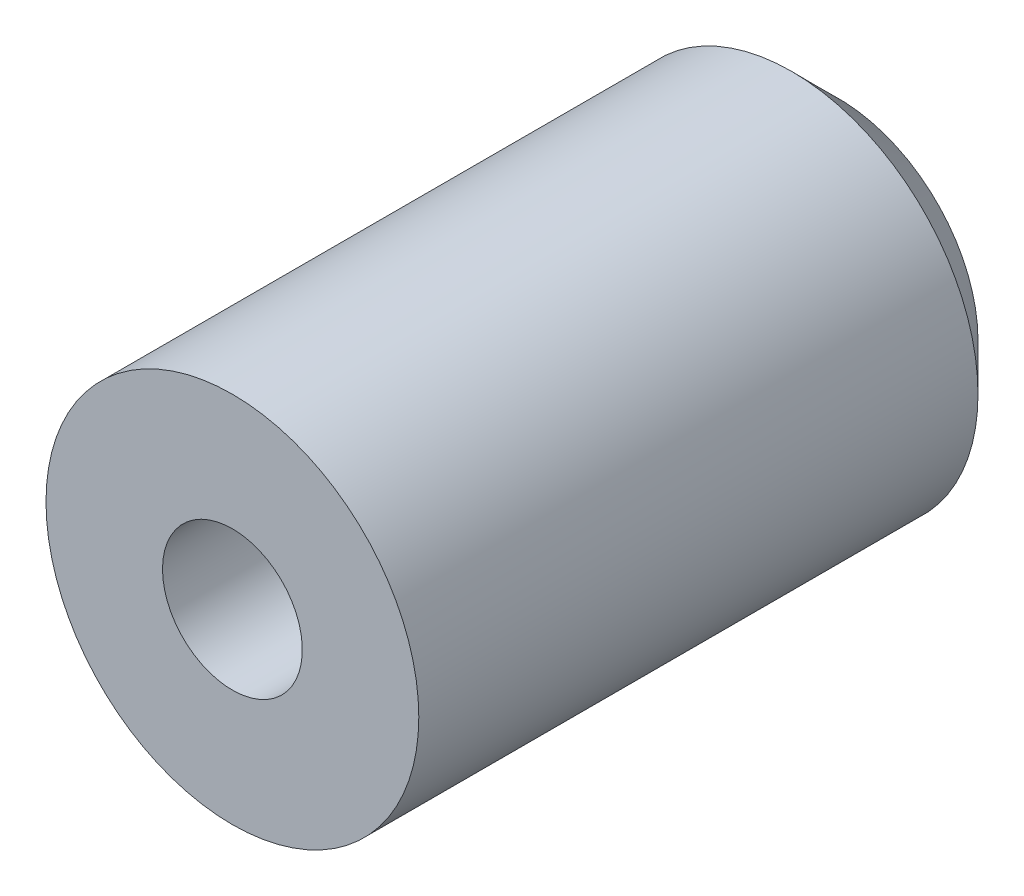
ISO-10303-21;
HEADER;
FILE_DESCRIPTION(('STEP AP214'),'2;1');
FILE_NAME('part.step','',(''),(''),'','','');
FILE_SCHEMA(('AUTOMOTIVE_DESIGN { 1 0 10303 214 1 1 1 1 }'));
ENDSEC;
DATA;
#1=APPLICATION_CONTEXT('core data for automotive mechanical design processes');
#2=APPLICATION_PROTOCOL_DEFINITION('international standard','automotive_design',2000,#1);
#3=PRODUCT_CONTEXT('',#1,'mechanical');
#4=PRODUCT('Part','Part','',(#3));
#5=PRODUCT_RELATED_PRODUCT_CATEGORY('part','',(#4));
#6=PRODUCT_DEFINITION_FORMATION('','',#4);
#7=PRODUCT_DEFINITION_CONTEXT('part definition',#1,'design');
#8=PRODUCT_DEFINITION('design','',#6,#7);
#9=PRODUCT_DEFINITION_SHAPE('','',#8);
#10=(LENGTH_UNIT() NAMED_UNIT(*) SI_UNIT(.MILLI.,.METRE.));
#11=(NAMED_UNIT(*) PLANE_ANGLE_UNIT() SI_UNIT($,.RADIAN.));
#12=(NAMED_UNIT(*) SI_UNIT($,.STERADIAN.) SOLID_ANGLE_UNIT());
#13=UNCERTAINTY_MEASURE_WITH_UNIT(LENGTH_MEASURE(1.E-05),#10,'distance_accuracy_value','');
#14=(GEOMETRIC_REPRESENTATION_CONTEXT(3) GLOBAL_UNCERTAINTY_ASSIGNED_CONTEXT((#13)) GLOBAL_UNIT_ASSIGNED_CONTEXT((#10,
#11,#12)) REPRESENTATION_CONTEXT('',''));
#15=CARTESIAN_POINT('',(0.,0.,0.));
#16=DIRECTION('',(0.,0.,1.));
#17=DIRECTION('',(1.,0.,0.));
#18=AXIS2_PLACEMENT_3D('',#15,#16,#17);
#19=CARTESIAN_POINT('',(0.,0.,13.));
#20=DIRECTION('',(0.,0.,1.));
#21=DIRECTION('',(1.,0.,0.));
#22=AXIS2_PLACEMENT_3D('',#19,#20,#21);
#23=PLANE('',#22);
#24=CARTESIAN_POINT('',(0.,0.,13.));
#25=DIRECTION('',(0.,0.,1.));
#26=DIRECTION('',(1.,0.,0.));
#27=AXIS2_PLACEMENT_3D('',#24,#25,#26);
#28=CIRCLE('',#27,4.);
#29=CARTESIAN_POINT('',(-4.,0.,13.));
#30=VERTEX_POINT('',#29);
#31=EDGE_CURVE('E42',#30,#30,#28,.T.);
#32=ORIENTED_EDGE('',*,*,#31,.T.);
#33=EDGE_LOOP('',(#32));
#34=FACE_BOUND('',#33,.T.);
#35=CARTESIAN_POINT('',(0.,0.,13.));
#36=DIRECTION('',(0.,0.,1.));
#37=DIRECTION('',(1.,0.,0.));
#38=AXIS2_PLACEMENT_3D('',#35,#36,#37);
#39=CIRCLE('',#38,1.5);
#40=CARTESIAN_POINT('',(-1.5,0.,13.));
#41=VERTEX_POINT('',#40);
#42=EDGE_CURVE('E46',#41,#41,#39,.T.);
#43=ORIENTED_EDGE('',*,*,#42,.F.);
#44=EDGE_LOOP('',(#43));
#45=FACE_BOUND('',#44,.T.);
#46=ADVANCED_FACE('F31',(#34,#45),#23,.T.);
#47=CARTESIAN_POINT('',(0.,0.,0.));
#48=DIRECTION('',(0.,0.,1.));
#49=DIRECTION('',(1.,0.,0.));
#50=AXIS2_PLACEMENT_3D('',#47,#48,#49);
#51=PLANE('',#50);
#52=CARTESIAN_POINT('',(0.,0.,0.));
#53=DIRECTION('',(0.,0.,1.));
#54=DIRECTION('',(1.,0.,0.));
#55=AXIS2_PLACEMENT_3D('',#52,#53,#54);
#56=CIRCLE('',#55,2.99999999999999);
#57=CARTESIAN_POINT('',(2.99999999999999,0.,0.));
#58=VERTEX_POINT('',#57);
#59=EDGE_CURVE('E10',#58,#58,#56,.F.);
#60=ORIENTED_EDGE('',*,*,#59,.T.);
#61=EDGE_LOOP('',(#60));
#62=FACE_BOUND('',#61,.T.);
#63=CARTESIAN_POINT('',(0.,0.,0.));
#64=DIRECTION('',(0.,0.,1.));
#65=DIRECTION('',(1.,0.,0.));
#66=AXIS2_PLACEMENT_3D('',#63,#64,#65);
#67=CIRCLE('',#66,1.5);
#68=CARTESIAN_POINT('',(-1.5,0.,0.));
#69=VERTEX_POINT('',#68);
#70=EDGE_CURVE('E49',#69,#69,#67,.T.);
#71=ORIENTED_EDGE('',*,*,#70,.T.);
#72=EDGE_LOOP('',(#71));
#73=FACE_BOUND('',#72,.T.);
#74=ADVANCED_FACE('F59',(#62,#73),#51,.F.);
#75=CARTESIAN_POINT('',(0.,0.,13.));
#76=DIRECTION('',(0.,0.,-1.));
#77=DIRECTION('',(-1.,0.,0.));
#78=AXIS2_PLACEMENT_3D('',#75,#76,#77);
#79=CYLINDRICAL_SURFACE('',#78,4.);
#80=CARTESIAN_POINT('',(0.,0.,1.00000000000001));
#81=DIRECTION('',(0.,0.,1.));
#82=DIRECTION('',(1.,0.,0.));
#83=AXIS2_PLACEMENT_3D('',#80,#81,#82);
#84=CIRCLE('',#83,4.);
#85=CARTESIAN_POINT('',(-4.,0.,1.00000000000001));
#86=VERTEX_POINT('',#85);
#87=EDGE_CURVE('E38',#86,#86,#84,.T.);
#88=CARTESIAN_POINT('',(-4.,0.,1.00000000000001));
#89=CARTESIAN_POINT('',(-4.,0.,1.12500000000001));
#90=CARTESIAN_POINT('',(-4.,0.,1.25000000000001));
#91=CARTESIAN_POINT('',(-4.,0.,1.50000000000001));
#92=CARTESIAN_POINT('',(-4.,0.,1.62500000000001));
#93=CARTESIAN_POINT('',(-4.,0.,1.87500000000001));
#94=CARTESIAN_POINT('',(-4.,0.,2.00000000000001));
#95=CARTESIAN_POINT('',(-4.,0.,2.25000000000001));
#96=CARTESIAN_POINT('',(-4.,0.,2.37500000000001));
#97=CARTESIAN_POINT('',(-4.,0.,2.62500000000001));
#98=CARTESIAN_POINT('',(-4.,0.,2.75000000000001));
#99=CARTESIAN_POINT('',(-4.,0.,3.00000000000001));
#100=CARTESIAN_POINT('',(-4.,0.,3.12500000000001));
#101=CARTESIAN_POINT('',(-4.,0.,3.37500000000001));
#102=CARTESIAN_POINT('',(-4.,0.,3.50000000000001));
#103=CARTESIAN_POINT('',(-4.,0.,3.75000000000001));
#104=CARTESIAN_POINT('',(-4.,0.,3.87500000000001));
#105=CARTESIAN_POINT('',(-4.,0.,4.12500000000001));
#106=CARTESIAN_POINT('',(-4.,0.,4.25000000000001));
#107=CARTESIAN_POINT('',(-4.,0.,4.50000000000001));
#108=CARTESIAN_POINT('',(-4.,0.,4.62500000000001));
#109=CARTESIAN_POINT('',(-4.,0.,4.87500000000001));
#110=CARTESIAN_POINT('',(-4.,0.,5.00000000000001));
#111=CARTESIAN_POINT('',(-4.,0.,5.25000000000001));
#112=CARTESIAN_POINT('',(-4.,0.,5.37500000000001));
#113=CARTESIAN_POINT('',(-4.,0.,5.62500000000001));
#114=CARTESIAN_POINT('',(-4.,0.,5.75000000000001));
#115=CARTESIAN_POINT('',(-4.,0.,6.00000000000001));
#116=CARTESIAN_POINT('',(-4.,0.,6.12500000000001));
#117=CARTESIAN_POINT('',(-4.,0.,6.37500000000001));
#118=CARTESIAN_POINT('',(-4.,0.,6.50000000000001));
#119=CARTESIAN_POINT('',(-4.,0.,6.75000000000001));
#120=CARTESIAN_POINT('',(-4.,0.,6.87500000000001));
#121=CARTESIAN_POINT('',(-4.,0.,7.12500000000001));
#122=CARTESIAN_POINT('',(-4.,0.,7.25000000000001));
#123=CARTESIAN_POINT('',(-4.,0.,7.50000000000001));
#124=CARTESIAN_POINT('',(-4.,0.,7.62500000000001));
#125=CARTESIAN_POINT('',(-4.,0.,7.87500000000001));
#126=CARTESIAN_POINT('',(-4.,0.,8.00000000000001));
#127=CARTESIAN_POINT('',(-4.,0.,8.25000000000001));
#128=CARTESIAN_POINT('',(-4.,0.,8.375));
#129=CARTESIAN_POINT('',(-4.,0.,8.625));
#130=CARTESIAN_POINT('',(-4.,0.,8.75));
#131=CARTESIAN_POINT('',(-4.,0.,9.00000000000001));
#132=CARTESIAN_POINT('',(-4.,0.,9.12500000000001));
#133=CARTESIAN_POINT('',(-4.,0.,9.37500000000001));
#134=CARTESIAN_POINT('',(-4.,0.,9.50000000000001));
#135=CARTESIAN_POINT('',(-4.,0.,9.75000000000001));
#136=CARTESIAN_POINT('',(-4.,0.,9.87500000000001));
#137=CARTESIAN_POINT('',(-4.,0.,10.125));
#138=CARTESIAN_POINT('',(-4.,0.,10.25));
#139=CARTESIAN_POINT('',(-4.,0.,10.5));
#140=CARTESIAN_POINT('',(-4.,0.,10.625));
#141=CARTESIAN_POINT('',(-4.,0.,10.875));
#142=CARTESIAN_POINT('',(-4.,0.,11.));
#143=CARTESIAN_POINT('',(-4.,0.,11.25));
#144=CARTESIAN_POINT('',(-4.,0.,11.375));
#145=CARTESIAN_POINT('',(-4.,0.,11.625));
#146=CARTESIAN_POINT('',(-4.,0.,11.75));
#147=CARTESIAN_POINT('',(-4.,0.,12.));
#148=CARTESIAN_POINT('',(-4.,0.,12.125));
#149=CARTESIAN_POINT('',(-4.,0.,12.375));
#150=CARTESIAN_POINT('',(-4.,0.,12.5));
#151=CARTESIAN_POINT('',(-4.,0.,12.75));
#152=CARTESIAN_POINT('',(-4.,0.,12.875));
#153=CARTESIAN_POINT('',(-4.,0.,13.));
#154=B_SPLINE_CURVE_WITH_KNOTS('',3,(#88,#89,#90,#91,#92,#93,#94,#95,#96,#97,#98,#99,#100,#101,
#102,#103,#104,#105,#106,#107,#108,#109,#110,#111,#112,#113,#114,#115,#116,#117,#118,#119,#120,
#121,#122,#123,#124,#125,#126,#127,#128,#129,#130,#131,#132,#133,#134,#135,#136,#137,#138,#139,
#140,#141,#142,#143,#144,#145,#146,#147,#148,#149,#150,#151,#152,#153),.UNSPECIFIED.,.F.,.F.,(4,
2,2,2,2,2,2,2,2,2,2,2,2,2,2,2,2,2,2,2,2,2,2,2,2,2,2,2,2,2,2,2,4),(0.,0.375,0.750000000000001,
1.125,1.5,1.875,2.25,2.625,3.,3.375,3.75,4.125,4.5,4.875,5.25,5.625,6.,6.375,6.75,7.125,7.5,
7.875,8.25,8.625,9.,9.375,9.75,10.125,10.5,10.875,11.25,11.625,12.),.UNSPECIFIED.);
#155=EDGE_CURVE('BSEAM66',#86,#30,#154,.T.);
#156=ORIENTED_EDGE('',*,*,#87,.T.);
#157=ORIENTED_EDGE('',*,*,#31,.F.);
#158=ORIENTED_EDGE('',*,*,#155,.T.);
#159=ORIENTED_EDGE('',*,*,#155,.F.);
#160=EDGE_LOOP('',(#156,#158,#157,#159));
#161=FACE_BOUND('',#160,.T.);
#162=ADVANCED_FACE('F66',(#161),#79,.T.);
#163=CARTESIAN_POINT('',(0.,0.,13.));
#164=DIRECTION('',(0.,0.,-1.));
#165=DIRECTION('',(-1.,0.,0.));
#166=AXIS2_PLACEMENT_3D('',#163,#164,#165);
#167=CYLINDRICAL_SURFACE('',#166,1.5);
#168=CARTESIAN_POINT('',(-1.5,0.,13.));
#169=CARTESIAN_POINT('',(-1.5,0.,12.8645833333333));
#170=CARTESIAN_POINT('',(-1.5,0.,12.7291666666667));
#171=CARTESIAN_POINT('',(-1.5,0.,12.4583333333333));
#172=CARTESIAN_POINT('',(-1.5,0.,12.3229166666667));
#173=CARTESIAN_POINT('',(-1.5,0.,12.0520833333333));
#174=CARTESIAN_POINT('',(-1.5,0.,11.9166666666667));
#175=CARTESIAN_POINT('',(-1.5,0.,11.6458333333333));
#176=CARTESIAN_POINT('',(-1.5,0.,11.5104166666667));
#177=CARTESIAN_POINT('',(-1.5,0.,11.2395833333333));
#178=CARTESIAN_POINT('',(-1.5,0.,11.1041666666667));
#179=CARTESIAN_POINT('',(-1.5,0.,10.8333333333333));
#180=CARTESIAN_POINT('',(-1.5,0.,10.6979166666667));
#181=CARTESIAN_POINT('',(-1.5,0.,10.4270833333333));
#182=CARTESIAN_POINT('',(-1.5,0.,10.2916666666667));
#183=CARTESIAN_POINT('',(-1.5,0.,10.0208333333333));
#184=CARTESIAN_POINT('',(-1.5,0.,9.88541666666667));
#185=CARTESIAN_POINT('',(-1.5,0.,9.61458333333333));
#186=CARTESIAN_POINT('',(-1.5,0.,9.47916666666667));
#187=CARTESIAN_POINT('',(-1.5,0.,9.20833333333333));
#188=CARTESIAN_POINT('',(-1.5,0.,9.07291666666667));
#189=CARTESIAN_POINT('',(-1.5,0.,8.80208333333333));
#190=CARTESIAN_POINT('',(-1.5,0.,8.66666666666667));
#191=CARTESIAN_POINT('',(-1.5,0.,8.39583333333334));
#192=CARTESIAN_POINT('',(-1.5,0.,8.26041666666667));
#193=CARTESIAN_POINT('',(-1.5,0.,7.98958333333333));
#194=CARTESIAN_POINT('',(-1.5,0.,7.85416666666667));
#195=CARTESIAN_POINT('',(-1.5,0.,7.58333333333333));
#196=CARTESIAN_POINT('',(-1.5,0.,7.44791666666667));
#197=CARTESIAN_POINT('',(-1.5,0.,7.17708333333333));
#198=CARTESIAN_POINT('',(-1.5,0.,7.04166666666667));
#199=CARTESIAN_POINT('',(-1.5,0.,6.77083333333333));
#200=CARTESIAN_POINT('',(-1.5,0.,6.63541666666667));
#201=CARTESIAN_POINT('',(-1.5,0.,6.36458333333333));
#202=CARTESIAN_POINT('',(-1.5,0.,6.22916666666667));
#203=CARTESIAN_POINT('',(-1.5,0.,5.95833333333333));
#204=CARTESIAN_POINT('',(-1.5,0.,5.82291666666667));
#205=CARTESIAN_POINT('',(-1.5,0.,5.55208333333333));
#206=CARTESIAN_POINT('',(-1.5,0.,5.41666666666667));
#207=CARTESIAN_POINT('',(-1.5,0.,5.14583333333333));
#208=CARTESIAN_POINT('',(-1.5,0.,5.01041666666667));
#209=CARTESIAN_POINT('',(-1.5,0.,4.73958333333333));
#210=CARTESIAN_POINT('',(-1.5,0.,4.60416666666667));
#211=CARTESIAN_POINT('',(-1.5,0.,4.33333333333333));
#212=CARTESIAN_POINT('',(-1.5,0.,4.19791666666667));
#213=CARTESIAN_POINT('',(-1.5,0.,3.92708333333333));
#214=CARTESIAN_POINT('',(-1.5,0.,3.79166666666667));
#215=CARTESIAN_POINT('',(-1.5,0.,3.52083333333333));
#216=CARTESIAN_POINT('',(-1.5,0.,3.38541666666667));
#217=CARTESIAN_POINT('',(-1.5,0.,3.11458333333333));
#218=CARTESIAN_POINT('',(-1.5,0.,2.97916666666667));
#219=CARTESIAN_POINT('',(-1.5,0.,2.70833333333333));
#220=CARTESIAN_POINT('',(-1.5,0.,2.57291666666667));
#221=CARTESIAN_POINT('',(-1.5,0.,2.30208333333333));
#222=CARTESIAN_POINT('',(-1.5,0.,2.16666666666667));
#223=CARTESIAN_POINT('',(-1.5,0.,1.89583333333333));
#224=CARTESIAN_POINT('',(-1.5,0.,1.76041666666667));
#225=CARTESIAN_POINT('',(-1.5,0.,1.48958333333333));
#226=CARTESIAN_POINT('',(-1.5,0.,1.35416666666667));
#227=CARTESIAN_POINT('',(-1.5,0.,1.08333333333333));
#228=CARTESIAN_POINT('',(-1.5,0.,0.947916666666666));
#229=CARTESIAN_POINT('',(-1.5,0.,0.677083333333332));
#230=CARTESIAN_POINT('',(-1.5,0.,0.541666666666665));
#231=CARTESIAN_POINT('',(-1.5,0.,0.270833333333332));
#232=CARTESIAN_POINT('',(-1.5,0.,0.135416666666665));
#233=CARTESIAN_POINT('',(-1.5,0.,0.));
#234=B_SPLINE_CURVE_WITH_KNOTS('',3,(#168,#169,#170,#171,#172,#173,#174,#175,#176,#177,#178,
#179,#180,#181,#182,#183,#184,#185,#186,#187,#188,#189,#190,#191,#192,#193,#194,#195,#196,#197,
#198,#199,#200,#201,#202,#203,#204,#205,#206,#207,#208,#209,#210,#211,#212,#213,#214,#215,#216,
#217,#218,#219,#220,#221,#222,#223,#224,#225,#226,#227,#228,#229,#230,#231,#232,#233),
.UNSPECIFIED.,.F.,.F.,(4,2,2,2,2,2,2,2,2,2,2,2,2,2,2,2,2,2,2,2,2,2,2,2,2,2,2,2,2,2,2,2,4),(0.,
0.40625,0.812500000000001,1.21875,1.625,2.03125,2.4375,2.84375,3.25,3.65625,4.0625,4.46875,
4.875,5.28125,5.6875,6.09375,6.5,6.90625,7.3125,7.71875000000001,8.125,8.53125,8.93750000000001,
9.34375000000001,9.75,10.15625,10.5625,10.96875,11.375,11.78125,12.1875,12.59375,13.),.UNSPECIFIED.);
#235=EDGE_CURVE('BSEAM55',#41,#69,#234,.T.);
#236=ORIENTED_EDGE('',*,*,#42,.T.);
#237=ORIENTED_EDGE('',*,*,#70,.F.);
#238=ORIENTED_EDGE('',*,*,#235,.T.);
#239=ORIENTED_EDGE('',*,*,#235,.F.);
#240=EDGE_LOOP('',(#236,#238,#237,#239));
#241=FACE_BOUND('',#240,.T.);
#242=ADVANCED_FACE('F55',(#241),#167,.F.);
#243=CARTESIAN_POINT('',(0.,0.,1.00000000000001));
#244=DIRECTION('',(0.,0.,1.));
#245=DIRECTION('',(1.,0.,0.));
#246=AXIS2_PLACEMENT_3D('',#243,#244,#245);
#247=CONICAL_SURFACE('',#246,4.,0.78539816339745);
#248=ORIENTED_EDGE('',*,*,#59,.F.);
#249=EDGE_LOOP('',(#248));
#250=FACE_BOUND('',#249,.T.);
#251=ORIENTED_EDGE('',*,*,#87,.F.);
#252=EDGE_LOOP('',(#251));
#253=FACE_BOUND('',#252,.T.);
#254=ADVANCED_FACE('F33',(#250,#253),#247,.T.);
#255=CLOSED_SHELL('',(#46,#74,#162,#242,#254));
#256=MANIFOLD_SOLID_BREP('B2',#255);
#257=ADVANCED_BREP_SHAPE_REPRESENTATION('',(#18,#256),#14);
#258=SHAPE_DEFINITION_REPRESENTATION(#9,#257);
ENDSEC;
END-ISO-10303-21;
